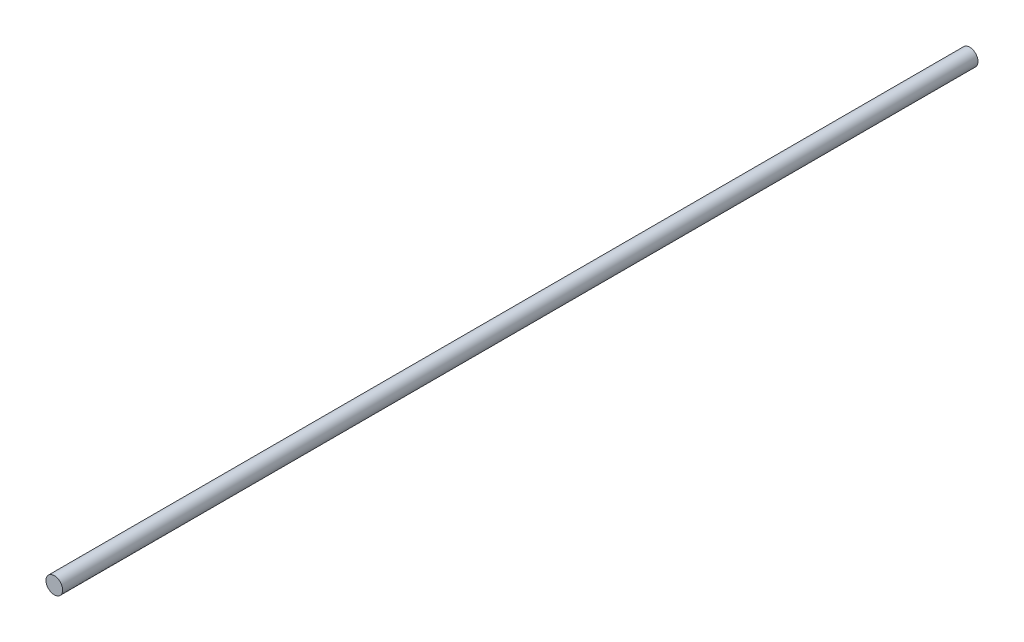
ISO-10303-21;
HEADER;
FILE_DESCRIPTION(('STEP AP214'),'2;1');
FILE_NAME('part.step','',(''),(''),'','','');
FILE_SCHEMA(('AUTOMOTIVE_DESIGN { 1 0 10303 214 1 1 1 1 }'));
ENDSEC;
DATA;
#1=APPLICATION_CONTEXT('core data for automotive mechanical design processes');
#2=APPLICATION_PROTOCOL_DEFINITION('international standard','automotive_design',2000,#1);
#3=PRODUCT_CONTEXT('',#1,'mechanical');
#4=PRODUCT('Part','Part','',(#3));
#5=PRODUCT_RELATED_PRODUCT_CATEGORY('part','',(#4));
#6=PRODUCT_DEFINITION_FORMATION('','',#4);
#7=PRODUCT_DEFINITION_CONTEXT('part definition',#1,'design');
#8=PRODUCT_DEFINITION('design','',#6,#7);
#9=PRODUCT_DEFINITION_SHAPE('','',#8);
#10=(LENGTH_UNIT() NAMED_UNIT(*) SI_UNIT(.MILLI.,.METRE.));
#11=(NAMED_UNIT(*) PLANE_ANGLE_UNIT() SI_UNIT($,.RADIAN.));
#12=(NAMED_UNIT(*) SI_UNIT($,.STERADIAN.) SOLID_ANGLE_UNIT());
#13=UNCERTAINTY_MEASURE_WITH_UNIT(LENGTH_MEASURE(1.E-05),#10,'distance_accuracy_value','');
#14=(GEOMETRIC_REPRESENTATION_CONTEXT(3) GLOBAL_UNCERTAINTY_ASSIGNED_CONTEXT((#13)) GLOBAL_UNIT_ASSIGNED_CONTEXT((#10,
#11,#12)) REPRESENTATION_CONTEXT('',''));
#15=CARTESIAN_POINT('',(0.,0.,0.));
#16=DIRECTION('',(0.,0.,1.));
#17=DIRECTION('',(1.,0.,0.));
#18=AXIS2_PLACEMENT_3D('',#15,#16,#17);
#19=CARTESIAN_POINT('',(0.,0.,550.));
#20=DIRECTION('',(0.,0.,-1.));
#21=DIRECTION('',(-1.,0.,0.));
#22=AXIS2_PLACEMENT_3D('',#19,#20,#21);
#23=CYLINDRICAL_SURFACE('',#22,5.);
#24=CARTESIAN_POINT('',(0.,0.,550.));
#25=DIRECTION('',(0.,0.,1.));
#26=DIRECTION('',(1.,0.,0.));
#27=AXIS2_PLACEMENT_3D('',#24,#25,#26);
#28=CIRCLE('',#27,5.);
#29=CARTESIAN_POINT('',(5.,0.,550.));
#30=VERTEX_POINT('',#29);
#31=EDGE_CURVE('E10',#30,#30,#28,.T.);
#32=ORIENTED_EDGE('',*,*,#31,.F.);
#33=EDGE_LOOP('',(#32));
#34=FACE_BOUND('',#33,.T.);
#35=CARTESIAN_POINT('',(0.,0.,0.));
#36=DIRECTION('',(0.,0.,1.));
#37=DIRECTION('',(1.,0.,0.));
#38=AXIS2_PLACEMENT_3D('',#35,#36,#37);
#39=CIRCLE('',#38,5.);
#40=CARTESIAN_POINT('',(5.,0.,0.));
#41=VERTEX_POINT('',#40);
#42=EDGE_CURVE('E35',#41,#41,#39,.T.);
#43=ORIENTED_EDGE('',*,*,#42,.T.);
#44=EDGE_LOOP('',(#43));
#45=FACE_BOUND('',#44,.T.);
#46=ADVANCED_FACE('F32',(#34,#45),#23,.T.);
#47=CARTESIAN_POINT('',(0.,0.,550.));
#48=DIRECTION('',(0.,0.,1.));
#49=DIRECTION('',(1.,0.,0.));
#50=AXIS2_PLACEMENT_3D('',#47,#48,#49);
#51=PLANE('',#50);
#52=ORIENTED_EDGE('',*,*,#31,.T.);
#53=EDGE_LOOP('',(#52));
#54=FACE_BOUND('',#53,.T.);
#55=ADVANCED_FACE('F47',(#54),#51,.T.);
#56=CARTESIAN_POINT('',(0.,0.,0.));
#57=DIRECTION('',(0.,0.,1.));
#58=DIRECTION('',(1.,0.,0.));
#59=AXIS2_PLACEMENT_3D('',#56,#57,#58);
#60=PLANE('',#59);
#61=ORIENTED_EDGE('',*,*,#42,.F.);
#62=EDGE_LOOP('',(#61));
#63=FACE_BOUND('',#62,.T.);
#64=ADVANCED_FACE('F45',(#63),#60,.F.);
#65=CLOSED_SHELL('',(#46,#55,#64));
#66=MANIFOLD_SOLID_BREP('B2',#65);
#67=ADVANCED_BREP_SHAPE_REPRESENTATION('',(#18,#66),#14);
#68=SHAPE_DEFINITION_REPRESENTATION(#9,#67);
ENDSEC;
END-ISO-10303-21;
